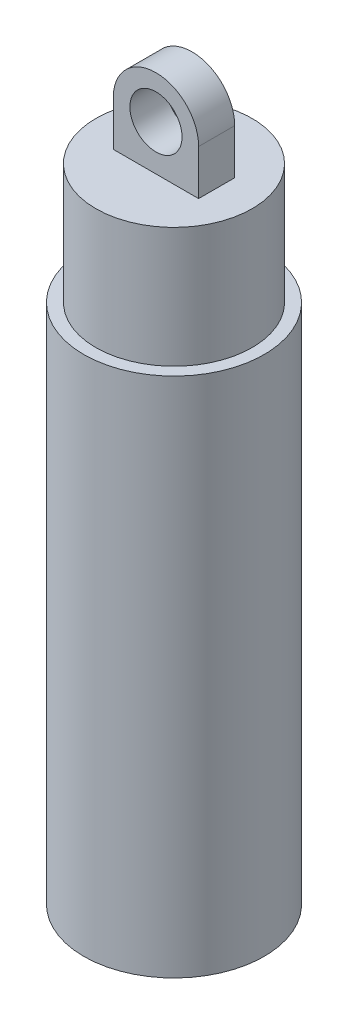
ISO-10303-21;
HEADER;
FILE_DESCRIPTION(('STEP AP214'),'2;1');
FILE_NAME('part.step','',(''),(''),'','','');
FILE_SCHEMA(('AUTOMOTIVE_DESIGN { 1 0 10303 214 1 1 1 1 }'));
ENDSEC;
DATA;
#1=APPLICATION_CONTEXT('core data for automotive mechanical design processes');
#2=APPLICATION_PROTOCOL_DEFINITION('international standard','automotive_design',2000,#1);
#3=PRODUCT_CONTEXT('',#1,'mechanical');
#4=PRODUCT('Part','Part','',(#3));
#5=PRODUCT_RELATED_PRODUCT_CATEGORY('part','',(#4));
#6=PRODUCT_DEFINITION_FORMATION('','',#4);
#7=PRODUCT_DEFINITION_CONTEXT('part definition',#1,'design');
#8=PRODUCT_DEFINITION('design','',#6,#7);
#9=PRODUCT_DEFINITION_SHAPE('','',#8);
#10=(LENGTH_UNIT() NAMED_UNIT(*) SI_UNIT(.MILLI.,.METRE.));
#11=(NAMED_UNIT(*) PLANE_ANGLE_UNIT() SI_UNIT($,.RADIAN.));
#12=(NAMED_UNIT(*) SI_UNIT($,.STERADIAN.) SOLID_ANGLE_UNIT());
#13=UNCERTAINTY_MEASURE_WITH_UNIT(LENGTH_MEASURE(1.E-05),#10,'distance_accuracy_value','');
#14=(GEOMETRIC_REPRESENTATION_CONTEXT(3) GLOBAL_UNCERTAINTY_ASSIGNED_CONTEXT((#13)) GLOBAL_UNIT_ASSIGNED_CONTEXT((#10,
#11,#12)) REPRESENTATION_CONTEXT('',''));
#15=CARTESIAN_POINT('',(0.,0.,0.));
#16=DIRECTION('',(0.,0.,1.));
#17=DIRECTION('',(1.,0.,0.));
#18=AXIS2_PLACEMENT_3D('',#15,#16,#17);
#19=CARTESIAN_POINT('',(0.,0.,0.));
#20=DIRECTION('',(0.,1.,0.));
#21=DIRECTION('',(0.,0.,1.));
#22=AXIS2_PLACEMENT_3D('',#19,#20,#21);
#23=PLANE('',#22);
#24=CARTESIAN_POINT('',(0.,0.,0.));
#25=DIRECTION('',(0.,1.,0.));
#26=DIRECTION('',(0.,0.,1.));
#27=AXIS2_PLACEMENT_3D('',#24,#25,#26);
#28=CIRCLE('',#27,7.5);
#29=CARTESIAN_POINT('',(0.,0.,7.5));
#30=VERTEX_POINT('',#29);
#31=EDGE_CURVE('E41',#30,#30,#28,.F.);
#32=ORIENTED_EDGE('',*,*,#31,.F.);
#33=EDGE_LOOP('',(#32));
#34=FACE_BOUND('',#33,.T.);
#35=CARTESIAN_POINT('',(0.,0.,0.));
#36=DIRECTION('',(0.,1.,0.));
#37=DIRECTION('',(0.,0.,1.));
#38=AXIS2_PLACEMENT_3D('',#35,#36,#37);
#39=CIRCLE('',#38,9.);
#40=CARTESIAN_POINT('',(0.,0.,-9.));
#41=VERTEX_POINT('',#40);
#42=EDGE_CURVE('E117',#41,#41,#39,.T.);
#43=ORIENTED_EDGE('',*,*,#42,.F.);
#44=EDGE_LOOP('',(#43));
#45=FACE_BOUND('',#44,.T.);
#46=ADVANCED_FACE('F37',(#34,#45),#23,.F.);
#47=CARTESIAN_POINT('',(0.,64.,0.));
#48=DIRECTION('',(0.,1.,0.));
#49=DIRECTION('',(0.,0.,1.));
#50=AXIS2_PLACEMENT_3D('',#47,#48,#49);
#51=PLANE('',#50);
#52=CARTESIAN_POINT('',(0.,64.,0.));
#53=DIRECTION('',(0.,1.,0.));
#54=DIRECTION('',(0.,0.,1.));
#55=AXIS2_PLACEMENT_3D('',#52,#53,#54);
#56=CIRCLE('',#55,7.8);
#57=CARTESIAN_POINT('',(0.,64.,7.8));
#58=VERTEX_POINT('',#57);
#59=EDGE_CURVE('E114',#58,#58,#56,.T.);
#60=ORIENTED_EDGE('',*,*,#59,.T.);
#61=EDGE_LOOP('',(#60));
#62=FACE_BOUND('',#61,.T.);
#63=DIRECTION('',(0.,0.,-1.));
#64=VECTOR('',#63,1.);
#65=CARTESIAN_POINT('',(-4.25499999999999,64.,0.));
#66=LINE('',#65,#64);
#67=CARTESIAN_POINT('',(-4.25499999999999,64.,1.8));
#68=VERTEX_POINT('',#67);
#69=CARTESIAN_POINT('',(-4.25499999999999,64.,-1.8));
#70=VERTEX_POINT('',#69);
#71=EDGE_CURVE('E56',#68,#70,#66,.T.);
#72=ORIENTED_EDGE('',*,*,#71,.T.);
#73=DIRECTION('',(1.,0.,0.));
#74=VECTOR('',#73,1.);
#75=CARTESIAN_POINT('',(0.,64.,-1.8));
#76=LINE('',#75,#74);
#77=CARTESIAN_POINT('',(4.25500000000001,64.,-1.8));
#78=VERTEX_POINT('',#77);
#79=EDGE_CURVE('E11',#70,#78,#76,.T.);
#80=ORIENTED_EDGE('',*,*,#79,.T.);
#81=DIRECTION('',(0.,0.,-1.));
#82=VECTOR('',#81,1.);
#83=CARTESIAN_POINT('',(4.25500000000001,64.,0.));
#84=LINE('',#83,#82);
#85=CARTESIAN_POINT('',(4.25500000000001,64.,1.8));
#86=VERTEX_POINT('',#85);
#87=EDGE_CURVE('E46',#86,#78,#84,.T.);
#88=ORIENTED_EDGE('',*,*,#87,.F.);
#89=DIRECTION('',(1.,0.,0.));
#90=VECTOR('',#89,1.);
#91=CARTESIAN_POINT('',(0.,64.,1.8));
#92=LINE('',#91,#90);
#93=EDGE_CURVE('E82',#68,#86,#92,.T.);
#94=ORIENTED_EDGE('',*,*,#93,.F.);
#95=EDGE_LOOP('',(#72,#80,#88,#94));
#96=FACE_BOUND('',#95,.T.);
#97=ADVANCED_FACE('F147',(#62,#96),#51,.T.);
#98=CARTESIAN_POINT('',(0.,52.,0.));
#99=DIRECTION('',(0.,-1.,0.));
#100=DIRECTION('',(0.,0.,-1.));
#101=AXIS2_PLACEMENT_3D('',#98,#99,#100);
#102=CYLINDRICAL_SURFACE('',#101,9.);
#103=CARTESIAN_POINT('',(0.,52.,0.));
#104=DIRECTION('',(0.,1.,0.));
#105=DIRECTION('',(0.,0.,1.));
#106=AXIS2_PLACEMENT_3D('',#103,#104,#105);
#107=CIRCLE('',#106,9.);
#108=CARTESIAN_POINT('',(0.,52.,-9.));
#109=VERTEX_POINT('',#108);
#110=EDGE_CURVE('E120',#109,#109,#107,.T.);
#111=CARTESIAN_POINT('',(0.,52.,-9.));
#112=CARTESIAN_POINT('',(0.,51.4583333333333,-9.));
#113=CARTESIAN_POINT('',(0.,50.9166666666667,-9.));
#114=CARTESIAN_POINT('',(0.,49.8333333333333,-9.));
#115=CARTESIAN_POINT('',(0.,49.2916666666667,-9.));
#116=CARTESIAN_POINT('',(0.,48.2083333333333,-9.));
#117=CARTESIAN_POINT('',(0.,47.6666666666667,-9.));
#118=CARTESIAN_POINT('',(0.,46.5833333333333,-9.));
#119=CARTESIAN_POINT('',(0.,46.0416666666667,-9.));
#120=CARTESIAN_POINT('',(0.,44.9583333333333,-9.));
#121=CARTESIAN_POINT('',(0.,44.4166666666667,-9.));
#122=CARTESIAN_POINT('',(0.,43.3333333333333,-9.));
#123=CARTESIAN_POINT('',(0.,42.7916666666667,-9.));
#124=CARTESIAN_POINT('',(0.,41.7083333333333,-9.));
#125=CARTESIAN_POINT('',(0.,41.1666666666667,-9.));
#126=CARTESIAN_POINT('',(0.,40.0833333333333,-9.));
#127=CARTESIAN_POINT('',(0.,39.5416666666667,-9.));
#128=CARTESIAN_POINT('',(0.,38.4583333333333,-9.));
#129=CARTESIAN_POINT('',(0.,37.9166666666667,-9.));
#130=CARTESIAN_POINT('',(0.,36.8333333333333,-9.));
#131=CARTESIAN_POINT('',(0.,36.2916666666667,-9.));
#132=CARTESIAN_POINT('',(0.,35.2083333333333,-9.));
#133=CARTESIAN_POINT('',(0.,34.6666666666667,-9.));
#134=CARTESIAN_POINT('',(0.,33.5833333333333,-9.));
#135=CARTESIAN_POINT('',(0.,33.0416666666667,-9.));
#136=CARTESIAN_POINT('',(0.,31.9583333333333,-9.));
#137=CARTESIAN_POINT('',(0.,31.4166666666667,-9.));
#138=CARTESIAN_POINT('',(0.,30.3333333333333,-9.));
#139=CARTESIAN_POINT('',(0.,29.7916666666667,-9.));
#140=CARTESIAN_POINT('',(0.,28.7083333333333,-9.));
#141=CARTESIAN_POINT('',(0.,28.1666666666667,-9.));
#142=CARTESIAN_POINT('',(0.,27.0833333333333,-9.));
#143=CARTESIAN_POINT('',(0.,26.5416666666667,-9.));
#144=CARTESIAN_POINT('',(0.,25.4583333333333,-9.));
#145=CARTESIAN_POINT('',(0.,24.9166666666667,-9.));
#146=CARTESIAN_POINT('',(0.,23.8333333333333,-9.));
#147=CARTESIAN_POINT('',(0.,23.2916666666667,-9.));
#148=CARTESIAN_POINT('',(0.,22.2083333333333,-9.));
#149=CARTESIAN_POINT('',(0.,21.6666666666667,-9.));
#150=CARTESIAN_POINT('',(0.,20.5833333333333,-9.));
#151=CARTESIAN_POINT('',(0.,20.0416666666667,-9.));
#152=CARTESIAN_POINT('',(0.,18.9583333333333,-9.));
#153=CARTESIAN_POINT('',(0.,18.4166666666667,-9.));
#154=CARTESIAN_POINT('',(0.,17.3333333333333,-9.));
#155=CARTESIAN_POINT('',(0.,16.7916666666667,-9.));
#156=CARTESIAN_POINT('',(0.,15.7083333333333,-9.));
#157=CARTESIAN_POINT('',(0.,15.1666666666667,-9.));
#158=CARTESIAN_POINT('',(0.,14.0833333333333,-9.));
#159=CARTESIAN_POINT('',(0.,13.5416666666667,-9.));
#160=CARTESIAN_POINT('',(0.,12.4583333333333,-9.));
#161=CARTESIAN_POINT('',(0.,11.9166666666667,-9.));
#162=CARTESIAN_POINT('',(0.,10.8333333333333,-9.));
#163=CARTESIAN_POINT('',(0.,10.2916666666667,-9.));
#164=CARTESIAN_POINT('',(0.,9.20833333333333,-9.));
#165=CARTESIAN_POINT('',(0.,8.66666666666667,-9.));
#166=CARTESIAN_POINT('',(0.,7.58333333333333,-9.));
#167=CARTESIAN_POINT('',(0.,7.04166666666667,-9.));
#168=CARTESIAN_POINT('',(0.,5.95833333333333,-9.));
#169=CARTESIAN_POINT('',(0.,5.41666666666667,-9.));
#170=CARTESIAN_POINT('',(0.,4.33333333333333,-9.));
#171=CARTESIAN_POINT('',(0.,3.79166666666667,-9.));
#172=CARTESIAN_POINT('',(0.,2.70833333333334,-9.));
#173=CARTESIAN_POINT('',(0.,2.16666666666667,-9.));
#174=CARTESIAN_POINT('',(0.,1.08333333333333,-9.));
#175=CARTESIAN_POINT('',(0.,0.541666666666667,-9.));
#176=CARTESIAN_POINT('',(0.,0.,-9.));
#177=B_SPLINE_CURVE_WITH_KNOTS('',3,(#111,#112,#113,#114,#115,#116,#117,#118,#119,#120,#121,
#122,#123,#124,#125,#126,#127,#128,#129,#130,#131,#132,#133,#134,#135,#136,#137,#138,#139,#140,
#141,#142,#143,#144,#145,#146,#147,#148,#149,#150,#151,#152,#153,#154,#155,#156,#157,#158,#159,
#160,#161,#162,#163,#164,#165,#166,#167,#168,#169,#170,#171,#172,#173,#174,#175,#176),
.UNSPECIFIED.,.F.,.F.,(4,2,2,2,2,2,2,2,2,2,2,2,2,2,2,2,2,2,2,2,2,2,2,2,2,2,2,2,2,2,2,2,4),(0.,
1.62499999999999,3.25,4.875,6.49999999999999,8.12499999999999,9.74999999999999,11.375,13.,
14.625,16.25,17.875,19.5,21.125,22.75,24.375,26.,27.625,29.25,30.875,32.5,34.125,35.75,37.375,
39.,40.625,42.25,43.875,45.5,47.125,48.75,50.375,52.),.UNSPECIFIED.);
#178=EDGE_CURVE('BSEAM39',#109,#41,#177,.T.);
#179=ORIENTED_EDGE('',*,*,#110,.F.);
#180=ORIENTED_EDGE('',*,*,#42,.T.);
#181=ORIENTED_EDGE('',*,*,#178,.T.);
#182=ORIENTED_EDGE('',*,*,#178,.F.);
#183=EDGE_LOOP('',(#179,#181,#180,#182));
#184=FACE_BOUND('',#183,.T.);
#185=ADVANCED_FACE('F39',(#184),#102,.T.);
#186=CARTESIAN_POINT('',(0.,52.,0.));
#187=DIRECTION('',(0.,1.,0.));
#188=DIRECTION('',(0.,0.,1.));
#189=AXIS2_PLACEMENT_3D('',#186,#187,#188);
#190=PLANE('',#189);
#191=CARTESIAN_POINT('',(0.,52.,0.));
#192=DIRECTION('',(0.,1.,0.));
#193=DIRECTION('',(0.,0.,1.));
#194=AXIS2_PLACEMENT_3D('',#191,#192,#193);
#195=CIRCLE('',#194,7.8);
#196=CARTESIAN_POINT('',(0.,52.,7.8));
#197=VERTEX_POINT('',#196);
#198=EDGE_CURVE('E112',#197,#197,#195,.T.);
#199=ORIENTED_EDGE('',*,*,#198,.F.);
#200=EDGE_LOOP('',(#199));
#201=FACE_BOUND('',#200,.T.);
#202=ORIENTED_EDGE('',*,*,#110,.T.);
#203=EDGE_LOOP('',(#202));
#204=FACE_BOUND('',#203,.T.);
#205=ADVANCED_FACE('F159',(#201,#204),#190,.T.);
#206=CARTESIAN_POINT('',(0.,64.,0.));
#207=DIRECTION('',(0.,-1.,0.));
#208=DIRECTION('',(0.,0.,-1.));
#209=AXIS2_PLACEMENT_3D('',#206,#207,#208);
#210=CYLINDRICAL_SURFACE('',#209,7.8);
#211=ORIENTED_EDGE('',*,*,#59,.F.);
#212=EDGE_LOOP('',(#211));
#213=FACE_BOUND('',#212,.T.);
#214=ORIENTED_EDGE('',*,*,#198,.T.);
#215=EDGE_LOOP('',(#214));
#216=FACE_BOUND('',#215,.T.);
#217=ADVANCED_FACE('F142',(#213,#216),#210,.T.);
#218=CARTESIAN_POINT('',(4.255,0.,-1.8));
#219=DIRECTION('',(1.,0.,0.));
#220=DIRECTION('',(0.,1.,0.));
#221=AXIS2_PLACEMENT_3D('',#218,#219,#220);
#222=PLANE('',#221);
#223=DIRECTION('',(0.,1.,0.));
#224=VECTOR('',#223,1.);
#225=CARTESIAN_POINT('',(4.255,0.,1.8));
#226=LINE('',#225,#224);
#227=CARTESIAN_POINT('',(4.25500000000001,68.5,1.8));
#228=VERTEX_POINT('',#227);
#229=EDGE_CURVE('E76',#86,#228,#226,.T.);
#230=ORIENTED_EDGE('',*,*,#229,.F.);
#231=ORIENTED_EDGE('',*,*,#87,.T.);
#232=DIRECTION('',(0.,1.,0.));
#233=VECTOR('',#232,1.);
#234=CARTESIAN_POINT('',(4.255,0.,-1.8));
#235=LINE('',#234,#233);
#236=CARTESIAN_POINT('',(4.25500000000001,68.5,-1.8));
#237=VERTEX_POINT('',#236);
#238=EDGE_CURVE('E90',#78,#237,#235,.T.);
#239=ORIENTED_EDGE('',*,*,#238,.T.);
#240=DIRECTION('',(0.,0.,1.));
#241=VECTOR('',#240,1.);
#242=CARTESIAN_POINT('',(4.25500000000001,68.5,-1.8));
#243=LINE('',#242,#241);
#244=EDGE_CURVE('E87',#237,#228,#243,.T.);
#245=ORIENTED_EDGE('',*,*,#244,.T.);
#246=EDGE_LOOP('',(#230,#231,#239,#245));
#247=FACE_BOUND('',#246,.T.);
#248=ADVANCED_FACE('F88',(#247),#222,.T.);
#249=CARTESIAN_POINT('',(-4.255,0.,-1.8));
#250=DIRECTION('',(1.,0.,0.));
#251=DIRECTION('',(0.,1.,0.));
#252=AXIS2_PLACEMENT_3D('',#249,#250,#251);
#253=PLANE('',#252);
#254=ORIENTED_EDGE('',*,*,#71,.F.);
#255=DIRECTION('',(0.,1.,0.));
#256=VECTOR('',#255,1.);
#257=CARTESIAN_POINT('',(-4.255,0.,1.8));
#258=LINE('',#257,#256);
#259=CARTESIAN_POINT('',(-4.25499999999999,68.5,1.8));
#260=VERTEX_POINT('',#259);
#261=EDGE_CURVE('E100',#68,#260,#258,.T.);
#262=ORIENTED_EDGE('',*,*,#261,.T.);
#263=DIRECTION('',(0.,0.,1.));
#264=VECTOR('',#263,1.);
#265=CARTESIAN_POINT('',(-4.25499999999999,68.5,-1.8));
#266=LINE('',#265,#264);
#267=CARTESIAN_POINT('',(-4.25499999999999,68.5,-1.8));
#268=VERTEX_POINT('',#267);
#269=EDGE_CURVE('E94',#268,#260,#266,.T.);
#270=ORIENTED_EDGE('',*,*,#269,.F.);
#271=DIRECTION('',(0.,1.,0.));
#272=VECTOR('',#271,1.);
#273=CARTESIAN_POINT('',(-4.255,0.,-1.8));
#274=LINE('',#273,#272);
#275=EDGE_CURVE('E95',#70,#268,#274,.T.);
#276=ORIENTED_EDGE('',*,*,#275,.F.);
#277=EDGE_LOOP('',(#254,#262,#270,#276));
#278=FACE_BOUND('',#277,.T.);
#279=ADVANCED_FACE('F132',(#278),#253,.F.);
#280=CARTESIAN_POINT('',(0.,68.5,-1.8));
#281=DIRECTION('',(0.,0.,1.));
#282=DIRECTION('',(1.,0.,0.));
#283=AXIS2_PLACEMENT_3D('',#280,#281,#282);
#284=CYLINDRICAL_SURFACE('',#283,2.6);
#285=CARTESIAN_POINT('',(0.,68.5,-1.8));
#286=DIRECTION('',(0.,0.,1.));
#287=DIRECTION('',(1.,0.,0.));
#288=AXIS2_PLACEMENT_3D('',#285,#286,#287);
#289=CIRCLE('',#288,2.6);
#290=CARTESIAN_POINT('',(2.60000000000001,68.5,-1.8));
#291=VERTEX_POINT('',#290);
#292=EDGE_CURVE('E102',#291,#291,#289,.T.);
#293=ORIENTED_EDGE('',*,*,#292,.F.);
#294=EDGE_LOOP('',(#293));
#295=FACE_BOUND('',#294,.T.);
#296=CARTESIAN_POINT('',(0.,68.5,1.8));
#297=DIRECTION('',(0.,0.,1.));
#298=DIRECTION('',(1.,0.,0.));
#299=AXIS2_PLACEMENT_3D('',#296,#297,#298);
#300=CIRCLE('',#299,2.6);
#301=CARTESIAN_POINT('',(2.60000000000001,68.5,1.8));
#302=VERTEX_POINT('',#301);
#303=EDGE_CURVE('E84',#302,#302,#300,.T.);
#304=ORIENTED_EDGE('',*,*,#303,.T.);
#305=EDGE_LOOP('',(#304));
#306=FACE_BOUND('',#305,.T.);
#307=ADVANCED_FACE('F134',(#295,#306),#284,.F.);
#308=CARTESIAN_POINT('',(0.,68.5,-1.8));
#309=DIRECTION('',(0.,0.,1.));
#310=DIRECTION('',(1.,0.,0.));
#311=AXIS2_PLACEMENT_3D('',#308,#309,#310);
#312=CYLINDRICAL_SURFACE('',#311,4.255);
#313=ORIENTED_EDGE('',*,*,#269,.T.);
#314=CARTESIAN_POINT('',(0.,68.5,1.8));
#315=DIRECTION('',(0.,0.,1.));
#316=DIRECTION('',(1.,0.,0.));
#317=AXIS2_PLACEMENT_3D('',#314,#315,#316);
#318=CIRCLE('',#317,4.255);
#319=EDGE_CURVE('E81',#228,#260,#318,.T.);
#320=ORIENTED_EDGE('',*,*,#319,.F.);
#321=ORIENTED_EDGE('',*,*,#244,.F.);
#322=CARTESIAN_POINT('',(0.,68.5,-1.8));
#323=DIRECTION('',(0.,0.,1.));
#324=DIRECTION('',(1.,0.,0.));
#325=AXIS2_PLACEMENT_3D('',#322,#323,#324);
#326=CIRCLE('',#325,4.255);
#327=EDGE_CURVE('E109',#237,#268,#326,.T.);
#328=ORIENTED_EDGE('',*,*,#327,.T.);
#329=EDGE_LOOP('',(#313,#320,#321,#328));
#330=FACE_BOUND('',#329,.T.);
#331=ADVANCED_FACE('F98',(#330),#312,.T.);
#332=CARTESIAN_POINT('',(0.,0.,-1.8));
#333=DIRECTION('',(0.,0.,1.));
#334=DIRECTION('',(1.,0.,0.));
#335=AXIS2_PLACEMENT_3D('',#332,#333,#334);
#336=PLANE('',#335);
#337=ORIENTED_EDGE('',*,*,#79,.F.);
#338=ORIENTED_EDGE('',*,*,#275,.T.);
#339=ORIENTED_EDGE('',*,*,#327,.F.);
#340=ORIENTED_EDGE('',*,*,#238,.F.);
#341=EDGE_LOOP('',(#337,#338,#339,#340));
#342=FACE_BOUND('',#341,.T.);
#343=ORIENTED_EDGE('',*,*,#292,.T.);
#344=EDGE_LOOP('',(#343));
#345=FACE_BOUND('',#344,.T.);
#346=ADVANCED_FACE('F128',(#342,#345),#336,.F.);
#347=CARTESIAN_POINT('',(0.,0.,1.8));
#348=DIRECTION('',(0.,0.,1.));
#349=DIRECTION('',(1.,0.,0.));
#350=AXIS2_PLACEMENT_3D('',#347,#348,#349);
#351=PLANE('',#350);
#352=ORIENTED_EDGE('',*,*,#303,.F.);
#353=EDGE_LOOP('',(#352));
#354=FACE_BOUND('',#353,.T.);
#355=ORIENTED_EDGE('',*,*,#261,.F.);
#356=ORIENTED_EDGE('',*,*,#93,.T.);
#357=ORIENTED_EDGE('',*,*,#229,.T.);
#358=ORIENTED_EDGE('',*,*,#319,.T.);
#359=EDGE_LOOP('',(#355,#356,#357,#358));
#360=FACE_BOUND('',#359,.T.);
#361=ADVANCED_FACE('F79',(#354,#360),#351,.T.);
#362=CARTESIAN_POINT('',(0.,-27.,0.));
#363=DIRECTION('',(0.,1.,0.));
#364=DIRECTION('',(0.,0.,1.));
#365=AXIS2_PLACEMENT_3D('',#362,#363,#364);
#366=CYLINDRICAL_SURFACE('',#365,7.5);
#367=CARTESIAN_POINT('',(0.,36.,0.));
#368=DIRECTION('',(0.,-1.,0.));
#369=DIRECTION('',(0.,0.,-1.));
#370=AXIS2_PLACEMENT_3D('',#367,#368,#369);
#371=CIRCLE('',#370,7.5);
#372=CARTESIAN_POINT('',(0.,36.,-7.5));
#373=VERTEX_POINT('',#372);
#374=EDGE_CURVE('E186',#373,#373,#371,.T.);
#375=ORIENTED_EDGE('',*,*,#374,.F.);
#376=EDGE_LOOP('',(#375));
#377=FACE_BOUND('',#376,.T.);
#378=ORIENTED_EDGE('',*,*,#31,.T.);
#379=EDGE_LOOP('',(#378));
#380=FACE_BOUND('',#379,.T.);
#381=ADVANCED_FACE('F172',(#377,#380),#366,.F.);
#382=CARTESIAN_POINT('',(0.,36.,0.));
#383=DIRECTION('',(0.,-1.,0.));
#384=DIRECTION('',(0.,0.,-1.));
#385=AXIS2_PLACEMENT_3D('',#382,#383,#384);
#386=PLANE('',#385);
#387=ORIENTED_EDGE('',*,*,#374,.T.);
#388=EDGE_LOOP('',(#387));
#389=FACE_BOUND('',#388,.T.);
#390=ADVANCED_FACE('F178',(#389),#386,.T.);
#391=CLOSED_SHELL('',(#46,#97,#185,#205,#217,#248,#279,#307,#331,#346,#361,#381,#390));
#392=MANIFOLD_SOLID_BREP('B2',#391);
#393=ADVANCED_BREP_SHAPE_REPRESENTATION('',(#18,#392),#14);
#394=SHAPE_DEFINITION_REPRESENTATION(#9,#393);
ENDSEC;
END-ISO-10303-21;
